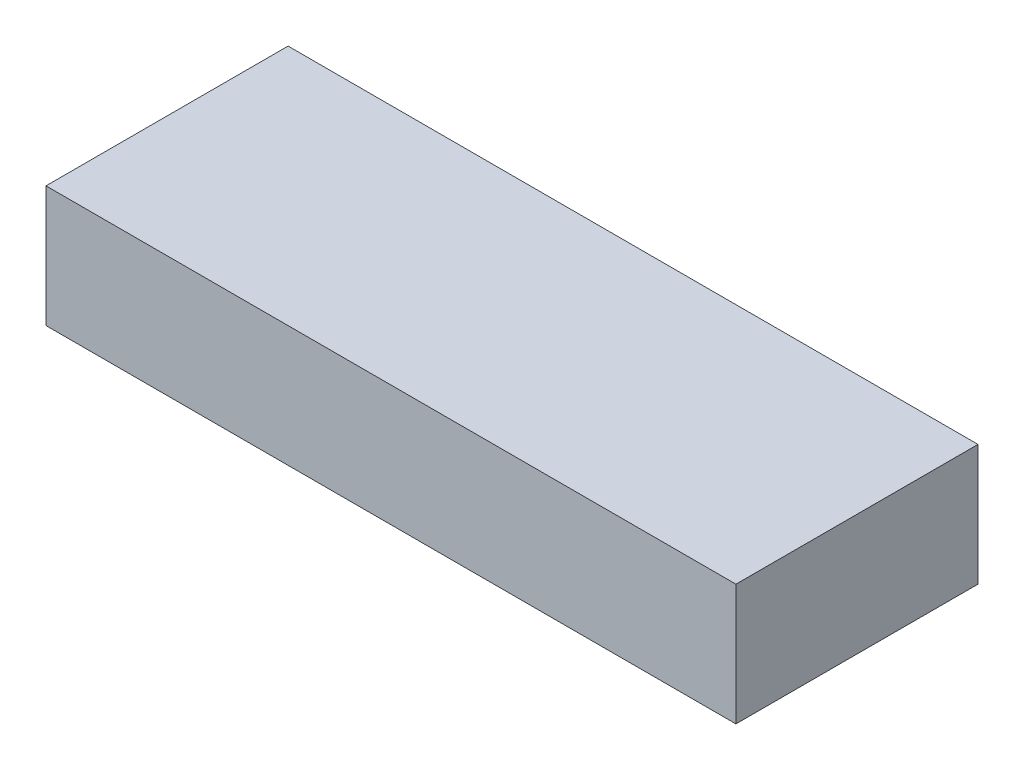
ISO-10303-21;
HEADER;
FILE_DESCRIPTION(('STEP AP214'),'2;1');
FILE_NAME('part.step','',(''),(''),'','','');
FILE_SCHEMA(('AUTOMOTIVE_DESIGN { 1 0 10303 214 1 1 1 1 }'));
ENDSEC;
DATA;
#1=APPLICATION_CONTEXT('core data for automotive mechanical design processes');
#2=APPLICATION_PROTOCOL_DEFINITION('international standard','automotive_design',2000,#1);
#3=PRODUCT_CONTEXT('',#1,'mechanical');
#4=PRODUCT('Part','Part','',(#3));
#5=PRODUCT_RELATED_PRODUCT_CATEGORY('part','',(#4));
#6=PRODUCT_DEFINITION_FORMATION('','',#4);
#7=PRODUCT_DEFINITION_CONTEXT('part definition',#1,'design');
#8=PRODUCT_DEFINITION('design','',#6,#7);
#9=PRODUCT_DEFINITION_SHAPE('','',#8);
#10=(LENGTH_UNIT() NAMED_UNIT(*) SI_UNIT(.MILLI.,.METRE.));
#11=(NAMED_UNIT(*) PLANE_ANGLE_UNIT() SI_UNIT($,.RADIAN.));
#12=(NAMED_UNIT(*) SI_UNIT($,.STERADIAN.) SOLID_ANGLE_UNIT());
#13=UNCERTAINTY_MEASURE_WITH_UNIT(LENGTH_MEASURE(1.E-05),#10,'distance_accuracy_value','');
#14=(GEOMETRIC_REPRESENTATION_CONTEXT(3) GLOBAL_UNCERTAINTY_ASSIGNED_CONTEXT((#13)) GLOBAL_UNIT_ASSIGNED_CONTEXT((#10,
#11,#12)) REPRESENTATION_CONTEXT('',''));
#15=CARTESIAN_POINT('',(0.,0.,0.));
#16=DIRECTION('',(0.,0.,1.));
#17=DIRECTION('',(1.,0.,0.));
#18=AXIS2_PLACEMENT_3D('',#15,#16,#17);
#19=CARTESIAN_POINT('',(0.,10.,0.));
#20=DIRECTION('',(1.,0.,0.));
#21=DIRECTION('',(0.,0.,-1.));
#22=AXIS2_PLACEMENT_3D('',#19,#20,#21);
#23=PLANE('',#22);
#24=DIRECTION('',(0.,0.,1.));
#25=VECTOR('',#24,1.);
#26=CARTESIAN_POINT('',(0.,0.,0.));
#27=LINE('',#26,#25);
#28=CARTESIAN_POINT('',(0.,0.,-20.));
#29=VERTEX_POINT('',#28);
#30=CARTESIAN_POINT('',(0.,0.,0.));
#31=VERTEX_POINT('',#30);
#32=EDGE_CURVE('E106',#29,#31,#27,.T.);
#33=ORIENTED_EDGE('',*,*,#32,.T.);
#34=DIRECTION('',(0.,-1.,0.));
#35=VECTOR('',#34,1.);
#36=CARTESIAN_POINT('',(0.,10.,0.));
#37=LINE('',#36,#35);
#38=CARTESIAN_POINT('',(0.,10.,0.));
#39=VERTEX_POINT('',#38);
#40=EDGE_CURVE('E11',#39,#31,#37,.T.);
#41=ORIENTED_EDGE('',*,*,#40,.F.);
#42=DIRECTION('',(0.,0.,1.));
#43=VECTOR('',#42,1.);
#44=CARTESIAN_POINT('',(0.,10.,0.));
#45=LINE('',#44,#43);
#46=CARTESIAN_POINT('',(0.,10.,-20.));
#47=VERTEX_POINT('',#46);
#48=EDGE_CURVE('E92',#47,#39,#45,.T.);
#49=ORIENTED_EDGE('',*,*,#48,.F.);
#50=DIRECTION('',(0.,-1.,0.));
#51=VECTOR('',#50,1.);
#52=CARTESIAN_POINT('',(0.,10.,-20.));
#53=LINE('',#52,#51);
#54=EDGE_CURVE('E105',#47,#29,#53,.T.);
#55=ORIENTED_EDGE('',*,*,#54,.T.);
#56=EDGE_LOOP('',(#33,#41,#49,#55));
#57=FACE_BOUND('',#56,.T.);
#58=ADVANCED_FACE('F43',(#57),#23,.F.);
#59=CARTESIAN_POINT('',(0.,10.,0.));
#60=DIRECTION('',(0.,0.,-1.));
#61=DIRECTION('',(-1.,0.,0.));
#62=AXIS2_PLACEMENT_3D('',#59,#60,#61);
#63=PLANE('',#62);
#64=DIRECTION('',(1.,0.,0.));
#65=VECTOR('',#64,1.);
#66=CARTESIAN_POINT('',(0.,0.,0.));
#67=LINE('',#66,#65);
#68=CARTESIAN_POINT('',(57.,0.,0.));
#69=VERTEX_POINT('',#68);
#70=EDGE_CURVE('E97',#31,#69,#67,.T.);
#71=ORIENTED_EDGE('',*,*,#70,.T.);
#72=DIRECTION('',(0.,-1.,0.));
#73=VECTOR('',#72,1.);
#74=CARTESIAN_POINT('',(57.,10.,0.));
#75=LINE('',#74,#73);
#76=CARTESIAN_POINT('',(57.,10.,0.));
#77=VERTEX_POINT('',#76);
#78=EDGE_CURVE('E51',#77,#69,#75,.T.);
#79=ORIENTED_EDGE('',*,*,#78,.F.);
#80=DIRECTION('',(1.,0.,0.));
#81=VECTOR('',#80,1.);
#82=CARTESIAN_POINT('',(0.,10.,0.));
#83=LINE('',#82,#81);
#84=EDGE_CURVE('E87',#39,#77,#83,.T.);
#85=ORIENTED_EDGE('',*,*,#84,.F.);
#86=ORIENTED_EDGE('',*,*,#40,.T.);
#87=EDGE_LOOP('',(#71,#79,#85,#86));
#88=FACE_BOUND('',#87,.T.);
#89=ADVANCED_FACE('F100',(#88),#63,.F.);
#90=CARTESIAN_POINT('',(57.,10.,0.));
#91=DIRECTION('',(-1.,0.,0.));
#92=DIRECTION('',(0.,0.,1.));
#93=AXIS2_PLACEMENT_3D('',#90,#91,#92);
#94=PLANE('',#93);
#95=DIRECTION('',(0.,0.,-1.));
#96=VECTOR('',#95,1.);
#97=CARTESIAN_POINT('',(57.,0.,0.));
#98=LINE('',#97,#96);
#99=CARTESIAN_POINT('',(57.,0.,-20.));
#100=VERTEX_POINT('',#99);
#101=EDGE_CURVE('E78',#69,#100,#98,.T.);
#102=ORIENTED_EDGE('',*,*,#101,.T.);
#103=DIRECTION('',(0.,-1.,0.));
#104=VECTOR('',#103,1.);
#105=CARTESIAN_POINT('',(57.,10.,-20.));
#106=LINE('',#105,#104);
#107=CARTESIAN_POINT('',(57.,10.,-20.));
#108=VERTEX_POINT('',#107);
#109=EDGE_CURVE('E98',#108,#100,#106,.T.);
#110=ORIENTED_EDGE('',*,*,#109,.F.);
#111=DIRECTION('',(0.,0.,-1.));
#112=VECTOR('',#111,1.);
#113=CARTESIAN_POINT('',(57.,10.,0.));
#114=LINE('',#113,#112);
#115=EDGE_CURVE('E95',#77,#108,#114,.T.);
#116=ORIENTED_EDGE('',*,*,#115,.F.);
#117=ORIENTED_EDGE('',*,*,#78,.T.);
#118=EDGE_LOOP('',(#102,#110,#116,#117));
#119=FACE_BOUND('',#118,.T.);
#120=ADVANCED_FACE('F99',(#119),#94,.F.);
#121=CARTESIAN_POINT('',(0.,10.,-20.));
#122=DIRECTION('',(0.,0.,1.));
#123=DIRECTION('',(1.,0.,0.));
#124=AXIS2_PLACEMENT_3D('',#121,#122,#123);
#125=PLANE('',#124);
#126=DIRECTION('',(-1.,0.,0.));
#127=VECTOR('',#126,1.);
#128=CARTESIAN_POINT('',(0.,0.,-20.));
#129=LINE('',#128,#127);
#130=EDGE_CURVE('E85',#100,#29,#129,.T.);
#131=ORIENTED_EDGE('',*,*,#130,.T.);
#132=ORIENTED_EDGE('',*,*,#54,.F.);
#133=DIRECTION('',(-1.,0.,0.));
#134=VECTOR('',#133,1.);
#135=CARTESIAN_POINT('',(0.,10.,-20.));
#136=LINE('',#135,#134);
#137=EDGE_CURVE('E56',#108,#47,#136,.T.);
#138=ORIENTED_EDGE('',*,*,#137,.F.);
#139=ORIENTED_EDGE('',*,*,#109,.T.);
#140=EDGE_LOOP('',(#131,#132,#138,#139));
#141=FACE_BOUND('',#140,.T.);
#142=ADVANCED_FACE('F111',(#141),#125,.F.);
#143=CARTESIAN_POINT('',(0.,10.,0.));
#144=DIRECTION('',(0.,-1.,0.));
#145=DIRECTION('',(0.,0.,-1.));
#146=AXIS2_PLACEMENT_3D('',#143,#144,#145);
#147=PLANE('',#146);
#148=ORIENTED_EDGE('',*,*,#48,.T.);
#149=ORIENTED_EDGE('',*,*,#84,.T.);
#150=ORIENTED_EDGE('',*,*,#115,.T.);
#151=ORIENTED_EDGE('',*,*,#137,.T.);
#152=EDGE_LOOP('',(#148,#149,#150,#151));
#153=FACE_BOUND('',#152,.T.);
#154=ADVANCED_FACE('F89',(#153),#147,.F.);
#155=CARTESIAN_POINT('',(0.,0.,0.));
#156=DIRECTION('',(0.,-1.,0.));
#157=DIRECTION('',(0.,0.,-1.));
#158=AXIS2_PLACEMENT_3D('',#155,#156,#157);
#159=PLANE('',#158);
#160=ORIENTED_EDGE('',*,*,#32,.F.);
#161=ORIENTED_EDGE('',*,*,#130,.F.);
#162=ORIENTED_EDGE('',*,*,#101,.F.);
#163=ORIENTED_EDGE('',*,*,#70,.F.);
#164=EDGE_LOOP('',(#160,#161,#162,#163));
#165=FACE_BOUND('',#164,.T.);
#166=ADVANCED_FACE('F116',(#165),#159,.T.);
#167=CLOSED_SHELL('',(#58,#89,#120,#142,#154,#166));
#168=MANIFOLD_SOLID_BREP('B2',#167);
#169=ADVANCED_BREP_SHAPE_REPRESENTATION('',(#18,#168),#14);
#170=SHAPE_DEFINITION_REPRESENTATION(#9,#169);
ENDSEC;
END-ISO-10303-21;
